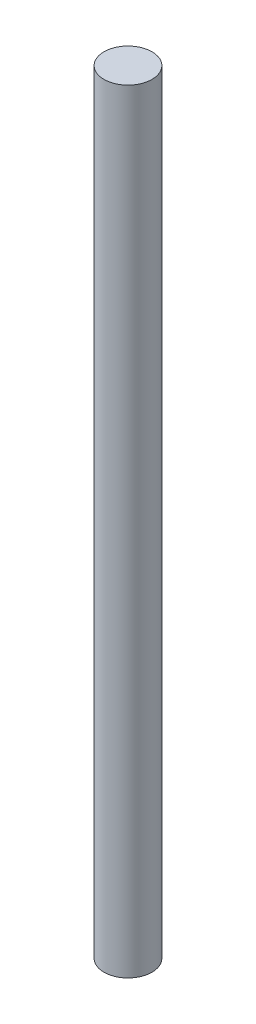
ISO-10303-21;
HEADER;
FILE_DESCRIPTION(('STEP AP214'),'2;1');
FILE_NAME('part.step','',(''),(''),'','','');
FILE_SCHEMA(('AUTOMOTIVE_DESIGN { 1 0 10303 214 1 1 1 1 }'));
ENDSEC;
DATA;
#1=APPLICATION_CONTEXT('core data for automotive mechanical design processes');
#2=APPLICATION_PROTOCOL_DEFINITION('international standard','automotive_design',2000,#1);
#3=PRODUCT_CONTEXT('',#1,'mechanical');
#4=PRODUCT('Part','Part','',(#3));
#5=PRODUCT_RELATED_PRODUCT_CATEGORY('part','',(#4));
#6=PRODUCT_DEFINITION_FORMATION('','',#4);
#7=PRODUCT_DEFINITION_CONTEXT('part definition',#1,'design');
#8=PRODUCT_DEFINITION('design','',#6,#7);
#9=PRODUCT_DEFINITION_SHAPE('','',#8);
#10=(LENGTH_UNIT() NAMED_UNIT(*) SI_UNIT(.MILLI.,.METRE.));
#11=(NAMED_UNIT(*) PLANE_ANGLE_UNIT() SI_UNIT($,.RADIAN.));
#12=(NAMED_UNIT(*) SI_UNIT($,.STERADIAN.) SOLID_ANGLE_UNIT());
#13=UNCERTAINTY_MEASURE_WITH_UNIT(LENGTH_MEASURE(1.E-05),#10,'distance_accuracy_value','');
#14=(GEOMETRIC_REPRESENTATION_CONTEXT(3) GLOBAL_UNCERTAINTY_ASSIGNED_CONTEXT((#13)) GLOBAL_UNIT_ASSIGNED_CONTEXT((#10,
#11,#12)) REPRESENTATION_CONTEXT('',''));
#15=CARTESIAN_POINT('',(0.,0.,0.));
#16=DIRECTION('',(0.,0.,1.));
#17=DIRECTION('',(1.,0.,0.));
#18=AXIS2_PLACEMENT_3D('',#15,#16,#17);
#19=CARTESIAN_POINT('',(0.,50.,0.));
#20=DIRECTION('',(0.,-1.,0.));
#21=DIRECTION('',(0.,0.,-1.));
#22=AXIS2_PLACEMENT_3D('',#19,#20,#21);
#23=CYLINDRICAL_SURFACE('',#22,1.55);
#24=CARTESIAN_POINT('',(0.,50.,0.));
#25=DIRECTION('',(0.,1.,0.));
#26=DIRECTION('',(0.,0.,1.));
#27=AXIS2_PLACEMENT_3D('',#24,#25,#26);
#28=CIRCLE('',#27,1.55);
#29=CARTESIAN_POINT('',(0.,50.,1.55));
#30=VERTEX_POINT('',#29);
#31=EDGE_CURVE('E10',#30,#30,#28,.T.);
#32=ORIENTED_EDGE('',*,*,#31,.F.);
#33=EDGE_LOOP('',(#32));
#34=FACE_BOUND('',#33,.T.);
#35=CARTESIAN_POINT('',(0.,0.,0.));
#36=DIRECTION('',(0.,1.,0.));
#37=DIRECTION('',(0.,0.,1.));
#38=AXIS2_PLACEMENT_3D('',#35,#36,#37);
#39=CIRCLE('',#38,1.55);
#40=CARTESIAN_POINT('',(0.,0.,1.55));
#41=VERTEX_POINT('',#40);
#42=EDGE_CURVE('E34',#41,#41,#39,.T.);
#43=ORIENTED_EDGE('',*,*,#42,.T.);
#44=EDGE_LOOP('',(#43));
#45=FACE_BOUND('',#44,.T.);
#46=ADVANCED_FACE('F31',(#34,#45),#23,.T.);
#47=CARTESIAN_POINT('',(0.,50.,0.));
#48=DIRECTION('',(0.,1.,0.));
#49=DIRECTION('',(0.,0.,1.));
#50=AXIS2_PLACEMENT_3D('',#47,#48,#49);
#51=PLANE('',#50);
#52=ORIENTED_EDGE('',*,*,#31,.T.);
#53=EDGE_LOOP('',(#52));
#54=FACE_BOUND('',#53,.T.);
#55=ADVANCED_FACE('F46',(#54),#51,.T.);
#56=CARTESIAN_POINT('',(0.,0.,0.));
#57=DIRECTION('',(0.,1.,0.));
#58=DIRECTION('',(0.,0.,1.));
#59=AXIS2_PLACEMENT_3D('',#56,#57,#58);
#60=PLANE('',#59);
#61=ORIENTED_EDGE('',*,*,#42,.F.);
#62=EDGE_LOOP('',(#61));
#63=FACE_BOUND('',#62,.T.);
#64=ADVANCED_FACE('F44',(#63),#60,.F.);
#65=CLOSED_SHELL('',(#46,#55,#64));
#66=MANIFOLD_SOLID_BREP('B2',#65);
#67=ADVANCED_BREP_SHAPE_REPRESENTATION('',(#18,#66),#14);
#68=SHAPE_DEFINITION_REPRESENTATION(#9,#67);
ENDSEC;
END-ISO-10303-21;
